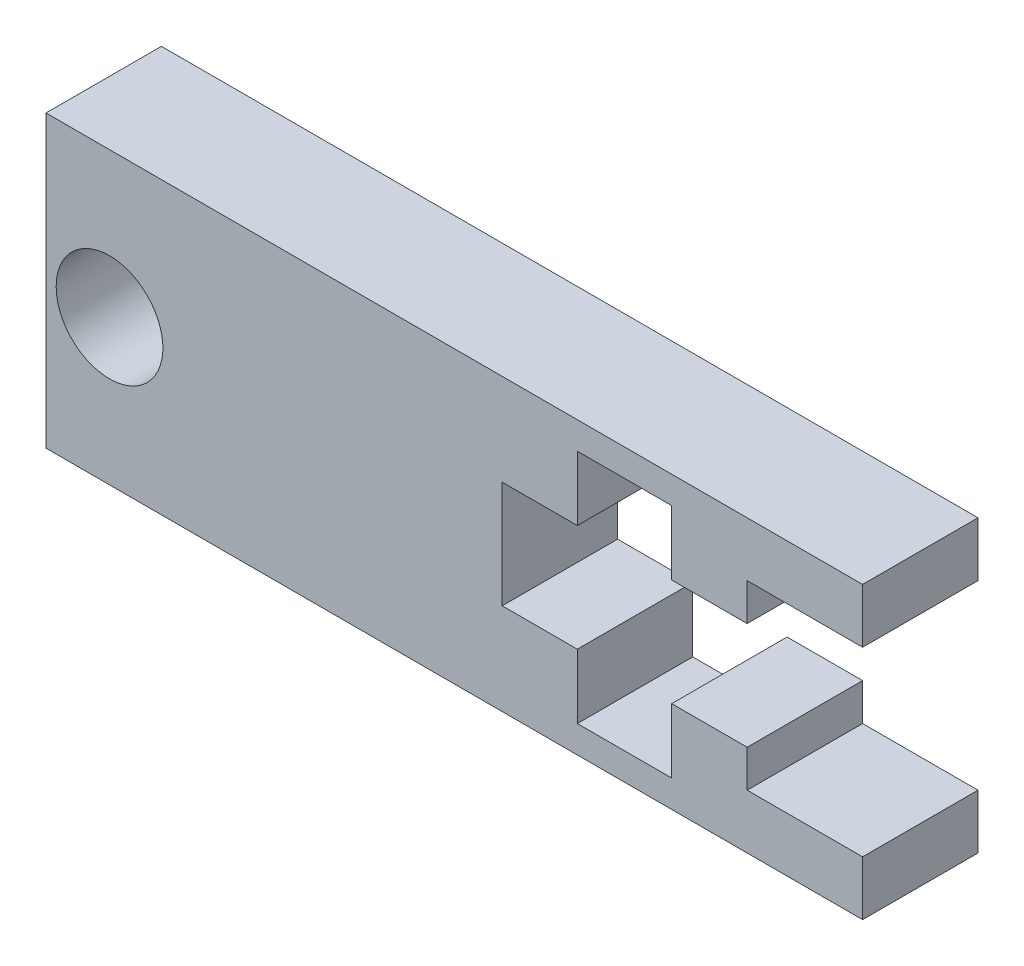
ISO-10303-21;
HEADER;
FILE_DESCRIPTION(('STEP AP214'),'2;1');
FILE_NAME('part.step','',(''),(''),'','','');
FILE_SCHEMA(('AUTOMOTIVE_DESIGN { 1 0 10303 214 1 1 1 1 }'));
ENDSEC;
DATA;
#1=APPLICATION_CONTEXT('core data for automotive mechanical design processes');
#2=APPLICATION_PROTOCOL_DEFINITION('international standard','automotive_design',2000,#1);
#3=PRODUCT_CONTEXT('',#1,'mechanical');
#4=PRODUCT('Part','Part','',(#3));
#5=PRODUCT_RELATED_PRODUCT_CATEGORY('part','',(#4));
#6=PRODUCT_DEFINITION_FORMATION('','',#4);
#7=PRODUCT_DEFINITION_CONTEXT('part definition',#1,'design');
#8=PRODUCT_DEFINITION('design','',#6,#7);
#9=PRODUCT_DEFINITION_SHAPE('','',#8);
#10=(LENGTH_UNIT() NAMED_UNIT(*) SI_UNIT(.MILLI.,.METRE.));
#11=(NAMED_UNIT(*) PLANE_ANGLE_UNIT() SI_UNIT($,.RADIAN.));
#12=(NAMED_UNIT(*) SI_UNIT($,.STERADIAN.) SOLID_ANGLE_UNIT());
#13=UNCERTAINTY_MEASURE_WITH_UNIT(LENGTH_MEASURE(1.E-05),#10,'distance_accuracy_value','');
#14=(GEOMETRIC_REPRESENTATION_CONTEXT(3) GLOBAL_UNCERTAINTY_ASSIGNED_CONTEXT((#13)) GLOBAL_UNIT_ASSIGNED_CONTEXT((#10,
#11,#12)) REPRESENTATION_CONTEXT('',''));
#15=CARTESIAN_POINT('',(0.,0.,0.));
#16=DIRECTION('',(0.,0.,1.));
#17=DIRECTION('',(1.,0.,0.));
#18=AXIS2_PLACEMENT_3D('',#15,#16,#17);
#19=CARTESIAN_POINT('',(11.25,-4.,1.59));
#20=DIRECTION('',(-1.,0.,0.));
#21=DIRECTION('',(0.,0.,1.));
#22=AXIS2_PLACEMENT_3D('',#19,#20,#21);
#23=PLANE('',#22);
#24=DIRECTION('',(0.,1.,0.));
#25=VECTOR('',#24,1.);
#26=CARTESIAN_POINT('',(11.25,-4.,1.59));
#27=LINE('',#26,#25);
#28=CARTESIAN_POINT('',(11.25,2.5,1.59));
#29=VERTEX_POINT('',#28);
#30=CARTESIAN_POINT('',(11.25,4.,1.59));
#31=VERTEX_POINT('',#30);
#32=EDGE_CURVE('E85',#29,#31,#27,.T.);
#33=ORIENTED_EDGE('',*,*,#32,.F.);
#34=DIRECTION('',(0.,0.,-1.));
#35=VECTOR('',#34,1.);
#36=CARTESIAN_POINT('',(11.25,2.5,1.59));
#37=LINE('',#36,#35);
#38=CARTESIAN_POINT('',(11.25,2.5,-1.59));
#39=VERTEX_POINT('',#38);
#40=EDGE_CURVE('E279',#29,#39,#37,.T.);
#41=ORIENTED_EDGE('',*,*,#40,.T.);
#42=DIRECTION('',(0.,1.,0.));
#43=VECTOR('',#42,1.);
#44=CARTESIAN_POINT('',(11.25,-4.,-1.59));
#45=LINE('',#44,#43);
#46=CARTESIAN_POINT('',(11.25,4.,-1.59));
#47=VERTEX_POINT('',#46);
#48=EDGE_CURVE('E312',#39,#47,#45,.T.);
#49=ORIENTED_EDGE('',*,*,#48,.T.);
#50=DIRECTION('',(0.,0.,-1.));
#51=VECTOR('',#50,1.);
#52=CARTESIAN_POINT('',(11.25,4.,1.59));
#53=LINE('',#52,#51);
#54=EDGE_CURVE('E11',#31,#47,#53,.T.);
#55=ORIENTED_EDGE('',*,*,#54,.F.);
#56=EDGE_LOOP('',(#33,#41,#49,#55));
#57=FACE_BOUND('',#56,.T.);
#58=ADVANCED_FACE('F33',(#57),#23,.F.);
#59=CARTESIAN_POINT('',(0.,0.,1.59));
#60=DIRECTION('',(0.,0.,-1.));
#61=DIRECTION('',(-1.,0.,0.));
#62=AXIS2_PLACEMENT_3D('',#59,#60,#61);
#63=PLANE('',#62);
#64=DIRECTION('',(0.,1.,0.));
#65=VECTOR('',#64,1.);
#66=CARTESIAN_POINT('',(8.07,1.475,1.59));
#67=LINE('',#66,#65);
#68=CARTESIAN_POINT('',(8.07,1.475,1.59));
#69=VERTEX_POINT('',#68);
#70=CARTESIAN_POINT('',(8.07,2.5,1.59));
#71=VERTEX_POINT('',#70);
#72=EDGE_CURVE('E237',#69,#71,#67,.T.);
#73=ORIENTED_EDGE('',*,*,#72,.T.);
#74=DIRECTION('',(1.,0.,0.));
#75=VECTOR('',#74,1.);
#76=CARTESIAN_POINT('',(11.25,2.5,1.59));
#77=LINE('',#76,#75);
#78=EDGE_CURVE('E239',#71,#29,#77,.T.);
#79=ORIENTED_EDGE('',*,*,#78,.T.);
#80=ORIENTED_EDGE('',*,*,#32,.T.);
#81=DIRECTION('',(-1.,0.,0.));
#82=VECTOR('',#81,1.);
#83=CARTESIAN_POINT('',(-11.25,4.,1.59));
#84=LINE('',#83,#82);
#85=CARTESIAN_POINT('',(-11.25,4.,1.59));
#86=VERTEX_POINT('',#85);
#87=EDGE_CURVE('E316',#31,#86,#84,.T.);
#88=ORIENTED_EDGE('',*,*,#87,.T.);
#89=DIRECTION('',(0.,-1.,0.));
#90=VECTOR('',#89,1.);
#91=CARTESIAN_POINT('',(-11.25,-4.,1.59));
#92=LINE('',#91,#90);
#93=CARTESIAN_POINT('',(-11.25,-4.,1.59));
#94=VERTEX_POINT('',#93);
#95=EDGE_CURVE('E318',#86,#94,#92,.T.);
#96=ORIENTED_EDGE('',*,*,#95,.T.);
#97=DIRECTION('',(1.,0.,0.));
#98=VECTOR('',#97,1.);
#99=CARTESIAN_POINT('',(-11.25,-4.,1.59));
#100=LINE('',#99,#98);
#101=CARTESIAN_POINT('',(11.25,-4.,1.59));
#102=VERTEX_POINT('',#101);
#103=EDGE_CURVE('E57',#94,#102,#100,.T.);
#104=ORIENTED_EDGE('',*,*,#103,.T.);
#105=CARTESIAN_POINT('',(11.25,-2.5,1.59));
#106=VERTEX_POINT('',#105);
#107=EDGE_CURVE('E200',#102,#106,#27,.T.);
#108=ORIENTED_EDGE('',*,*,#107,.T.);
#109=DIRECTION('',(-1.,0.,0.));
#110=VECTOR('',#109,1.);
#111=CARTESIAN_POINT('',(11.25,-2.5,1.59));
#112=LINE('',#111,#110);
#113=CARTESIAN_POINT('',(8.07,-2.5,1.59));
#114=VERTEX_POINT('',#113);
#115=EDGE_CURVE('E48',#106,#114,#112,.T.);
#116=ORIENTED_EDGE('',*,*,#115,.T.);
#117=DIRECTION('',(0.,1.,0.));
#118=VECTOR('',#117,1.);
#119=CARTESIAN_POINT('',(8.07,-2.5,1.59));
#120=LINE('',#119,#118);
#121=CARTESIAN_POINT('',(8.07,-1.475,1.59));
#122=VERTEX_POINT('',#121);
#123=EDGE_CURVE('E190',#114,#122,#120,.T.);
#124=ORIENTED_EDGE('',*,*,#123,.T.);
#125=DIRECTION('',(-1.,0.,0.));
#126=VECTOR('',#125,1.);
#127=CARTESIAN_POINT('',(8.07,-1.475,1.59));
#128=LINE('',#127,#126);
#129=CARTESIAN_POINT('',(5.99,-1.475,1.59));
#130=VERTEX_POINT('',#129);
#131=EDGE_CURVE('E194',#122,#130,#128,.T.);
#132=ORIENTED_EDGE('',*,*,#131,.T.);
#133=DIRECTION('',(0.,-1.,0.));
#134=VECTOR('',#133,1.);
#135=CARTESIAN_POINT('',(5.99,-3.25,1.59));
#136=LINE('',#135,#134);
#137=CARTESIAN_POINT('',(5.99,-3.25,1.59));
#138=VERTEX_POINT('',#137);
#139=EDGE_CURVE('E207',#130,#138,#136,.T.);
#140=ORIENTED_EDGE('',*,*,#139,.T.);
#141=DIRECTION('',(-1.,0.,0.));
#142=VECTOR('',#141,1.);
#143=CARTESIAN_POINT('',(3.39,-3.25,1.59));
#144=LINE('',#143,#142);
#145=CARTESIAN_POINT('',(3.39,-3.25,1.59));
#146=VERTEX_POINT('',#145);
#147=EDGE_CURVE('E210',#138,#146,#144,.T.);
#148=ORIENTED_EDGE('',*,*,#147,.T.);
#149=DIRECTION('',(0.,1.,0.));
#150=VECTOR('',#149,1.);
#151=CARTESIAN_POINT('',(3.39,-3.25,1.59));
#152=LINE('',#151,#150);
#153=CARTESIAN_POINT('',(3.39,-1.475,1.59));
#154=VERTEX_POINT('',#153);
#155=EDGE_CURVE('E213',#146,#154,#152,.T.);
#156=ORIENTED_EDGE('',*,*,#155,.T.);
#157=DIRECTION('',(-1.,0.,0.));
#158=VECTOR('',#157,1.);
#159=CARTESIAN_POINT('',(3.39,-1.475,1.59));
#160=LINE('',#159,#158);
#161=CARTESIAN_POINT('',(1.32,-1.475,1.59));
#162=VERTEX_POINT('',#161);
#163=EDGE_CURVE('E216',#154,#162,#160,.T.);
#164=ORIENTED_EDGE('',*,*,#163,.T.);
#165=DIRECTION('',(0.,1.,0.));
#166=VECTOR('',#165,1.);
#167=CARTESIAN_POINT('',(1.32,1.475,1.59));
#168=LINE('',#167,#166);
#169=CARTESIAN_POINT('',(1.32,1.475,1.59));
#170=VERTEX_POINT('',#169);
#171=EDGE_CURVE('E219',#162,#170,#168,.T.);
#172=ORIENTED_EDGE('',*,*,#171,.T.);
#173=DIRECTION('',(1.,0.,0.));
#174=VECTOR('',#173,1.);
#175=CARTESIAN_POINT('',(3.39,1.475,1.59));
#176=LINE('',#175,#174);
#177=CARTESIAN_POINT('',(3.39,1.475,1.59));
#178=VERTEX_POINT('',#177);
#179=EDGE_CURVE('E222',#170,#178,#176,.T.);
#180=ORIENTED_EDGE('',*,*,#179,.T.);
#181=DIRECTION('',(0.,1.,0.));
#182=VECTOR('',#181,1.);
#183=CARTESIAN_POINT('',(3.39,1.475,1.59));
#184=LINE('',#183,#182);
#185=CARTESIAN_POINT('',(3.39,3.25,1.59));
#186=VERTEX_POINT('',#185);
#187=EDGE_CURVE('E225',#178,#186,#184,.T.);
#188=ORIENTED_EDGE('',*,*,#187,.T.);
#189=DIRECTION('',(1.,0.,0.));
#190=VECTOR('',#189,1.);
#191=CARTESIAN_POINT('',(3.39,3.25,1.59));
#192=LINE('',#191,#190);
#193=CARTESIAN_POINT('',(5.99,3.25,1.59));
#194=VERTEX_POINT('',#193);
#195=EDGE_CURVE('E228',#186,#194,#192,.T.);
#196=ORIENTED_EDGE('',*,*,#195,.T.);
#197=DIRECTION('',(0.,-1.,0.));
#198=VECTOR('',#197,1.);
#199=CARTESIAN_POINT('',(5.99,1.475,1.59));
#200=LINE('',#199,#198);
#201=CARTESIAN_POINT('',(5.99,1.475,1.59));
#202=VERTEX_POINT('',#201);
#203=EDGE_CURVE('E231',#194,#202,#200,.T.);
#204=ORIENTED_EDGE('',*,*,#203,.T.);
#205=DIRECTION('',(1.,0.,0.));
#206=VECTOR('',#205,1.);
#207=CARTESIAN_POINT('',(8.07,1.475,1.59));
#208=LINE('',#207,#206);
#209=EDGE_CURVE('E234',#202,#69,#208,.T.);
#210=ORIENTED_EDGE('',*,*,#209,.T.);
#211=EDGE_LOOP('',(#73,#79,#80,#88,#96,#104,#108,#116,#124,#132,#140,#148,#156,#164,#172,#180,
#188,#196,#204,#210));
#212=FACE_BOUND('',#211,.T.);
#213=CARTESIAN_POINT('',(-9.49999999999999,0.,1.59));
#214=DIRECTION('',(0.,0.,1.));
#215=DIRECTION('',(1.,0.,0.));
#216=AXIS2_PLACEMENT_3D('',#213,#214,#215);
#217=CIRCLE('',#216,1.47);
#218=CARTESIAN_POINT('',(-10.97,0.,1.59));
#219=VERTEX_POINT('',#218);
#220=EDGE_CURVE('E309',#219,#219,#217,.T.);
#221=ORIENTED_EDGE('',*,*,#220,.F.);
#222=EDGE_LOOP('',(#221));
#223=FACE_BOUND('',#222,.T.);
#224=ADVANCED_FACE('F197',(#212,#223),#63,.F.);
#225=CARTESIAN_POINT('',(0.,0.,-1.59));
#226=DIRECTION('',(0.,0.,-1.));
#227=DIRECTION('',(-1.,0.,0.));
#228=AXIS2_PLACEMENT_3D('',#225,#226,#227);
#229=PLANE('',#228);
#230=DIRECTION('',(1.,0.,0.));
#231=VECTOR('',#230,1.);
#232=CARTESIAN_POINT('',(11.25,2.5,-1.59));
#233=LINE('',#232,#231);
#234=CARTESIAN_POINT('',(8.07,2.5,-1.59));
#235=VERTEX_POINT('',#234);
#236=EDGE_CURVE('E201',#235,#39,#233,.T.);
#237=ORIENTED_EDGE('',*,*,#236,.F.);
#238=DIRECTION('',(0.,1.,0.));
#239=VECTOR('',#238,1.);
#240=CARTESIAN_POINT('',(8.07,1.475,-1.59));
#241=LINE('',#240,#239);
#242=CARTESIAN_POINT('',(8.07,1.475,-1.59));
#243=VERTEX_POINT('',#242);
#244=EDGE_CURVE('E203',#243,#235,#241,.T.);
#245=ORIENTED_EDGE('',*,*,#244,.F.);
#246=DIRECTION('',(1.,0.,0.));
#247=VECTOR('',#246,1.);
#248=CARTESIAN_POINT('',(8.07,1.475,-1.59));
#249=LINE('',#248,#247);
#250=CARTESIAN_POINT('',(5.99,1.475,-1.59));
#251=VERTEX_POINT('',#250);
#252=EDGE_CURVE('E274',#251,#243,#249,.T.);
#253=ORIENTED_EDGE('',*,*,#252,.F.);
#254=DIRECTION('',(0.,-1.,0.));
#255=VECTOR('',#254,1.);
#256=CARTESIAN_POINT('',(5.99,1.475,-1.59));
#257=LINE('',#256,#255);
#258=CARTESIAN_POINT('',(5.99,3.25,-1.59));
#259=VERTEX_POINT('',#258);
#260=EDGE_CURVE('E271',#259,#251,#257,.T.);
#261=ORIENTED_EDGE('',*,*,#260,.F.);
#262=DIRECTION('',(1.,0.,0.));
#263=VECTOR('',#262,1.);
#264=CARTESIAN_POINT('',(3.39,3.25,-1.59));
#265=LINE('',#264,#263);
#266=CARTESIAN_POINT('',(3.39,3.25,-1.59));
#267=VERTEX_POINT('',#266);
#268=EDGE_CURVE('E268',#267,#259,#265,.T.);
#269=ORIENTED_EDGE('',*,*,#268,.F.);
#270=DIRECTION('',(0.,1.,0.));
#271=VECTOR('',#270,1.);
#272=CARTESIAN_POINT('',(3.39,1.475,-1.59));
#273=LINE('',#272,#271);
#274=CARTESIAN_POINT('',(3.39,1.475,-1.59));
#275=VERTEX_POINT('',#274);
#276=EDGE_CURVE('E265',#275,#267,#273,.T.);
#277=ORIENTED_EDGE('',*,*,#276,.F.);
#278=DIRECTION('',(1.,0.,0.));
#279=VECTOR('',#278,1.);
#280=CARTESIAN_POINT('',(3.39,1.475,-1.59));
#281=LINE('',#280,#279);
#282=CARTESIAN_POINT('',(1.32,1.475,-1.59));
#283=VERTEX_POINT('',#282);
#284=EDGE_CURVE('E262',#283,#275,#281,.T.);
#285=ORIENTED_EDGE('',*,*,#284,.F.);
#286=DIRECTION('',(0.,1.,0.));
#287=VECTOR('',#286,1.);
#288=CARTESIAN_POINT('',(1.32,1.475,-1.59));
#289=LINE('',#288,#287);
#290=CARTESIAN_POINT('',(1.32,-1.475,-1.59));
#291=VERTEX_POINT('',#290);
#292=EDGE_CURVE('E259',#291,#283,#289,.T.);
#293=ORIENTED_EDGE('',*,*,#292,.F.);
#294=DIRECTION('',(-1.,0.,0.));
#295=VECTOR('',#294,1.);
#296=CARTESIAN_POINT('',(3.39,-1.475,-1.59));
#297=LINE('',#296,#295);
#298=CARTESIAN_POINT('',(3.39,-1.475,-1.59));
#299=VERTEX_POINT('',#298);
#300=EDGE_CURVE('E256',#299,#291,#297,.T.);
#301=ORIENTED_EDGE('',*,*,#300,.F.);
#302=DIRECTION('',(0.,1.,0.));
#303=VECTOR('',#302,1.);
#304=CARTESIAN_POINT('',(3.39,-3.25,-1.59));
#305=LINE('',#304,#303);
#306=CARTESIAN_POINT('',(3.39,-3.25,-1.59));
#307=VERTEX_POINT('',#306);
#308=EDGE_CURVE('E253',#307,#299,#305,.T.);
#309=ORIENTED_EDGE('',*,*,#308,.F.);
#310=DIRECTION('',(-1.,0.,0.));
#311=VECTOR('',#310,1.);
#312=CARTESIAN_POINT('',(3.39,-3.25,-1.59));
#313=LINE('',#312,#311);
#314=CARTESIAN_POINT('',(5.99,-3.25,-1.59));
#315=VERTEX_POINT('',#314);
#316=EDGE_CURVE('E250',#315,#307,#313,.T.);
#317=ORIENTED_EDGE('',*,*,#316,.F.);
#318=DIRECTION('',(0.,-1.,0.));
#319=VECTOR('',#318,1.);
#320=CARTESIAN_POINT('',(5.99,-3.25,-1.59));
#321=LINE('',#320,#319);
#322=CARTESIAN_POINT('',(5.99,-1.475,-1.59));
#323=VERTEX_POINT('',#322);
#324=EDGE_CURVE('E247',#323,#315,#321,.T.);
#325=ORIENTED_EDGE('',*,*,#324,.F.);
#326=DIRECTION('',(-1.,0.,0.));
#327=VECTOR('',#326,1.);
#328=CARTESIAN_POINT('',(8.07,-1.475,-1.59));
#329=LINE('',#328,#327);
#330=CARTESIAN_POINT('',(8.07,-1.475,-1.59));
#331=VERTEX_POINT('',#330);
#332=EDGE_CURVE('E244',#331,#323,#329,.T.);
#333=ORIENTED_EDGE('',*,*,#332,.F.);
#334=DIRECTION('',(0.,1.,0.));
#335=VECTOR('',#334,1.);
#336=CARTESIAN_POINT('',(8.07,-2.5,-1.59));
#337=LINE('',#336,#335);
#338=CARTESIAN_POINT('',(8.07,-2.5,-1.59));
#339=VERTEX_POINT('',#338);
#340=EDGE_CURVE('E242',#339,#331,#337,.T.);
#341=ORIENTED_EDGE('',*,*,#340,.F.);
#342=DIRECTION('',(-1.,0.,0.));
#343=VECTOR('',#342,1.);
#344=CARTESIAN_POINT('',(11.25,-2.5,-1.59));
#345=LINE('',#344,#343);
#346=CARTESIAN_POINT('',(11.25,-2.5,-1.59));
#347=VERTEX_POINT('',#346);
#348=EDGE_CURVE('E182',#347,#339,#345,.T.);
#349=ORIENTED_EDGE('',*,*,#348,.F.);
#350=CARTESIAN_POINT('',(11.25,-4.,-1.59));
#351=VERTEX_POINT('',#350);
#352=EDGE_CURVE('E322',#351,#347,#45,.T.);
#353=ORIENTED_EDGE('',*,*,#352,.F.);
#354=DIRECTION('',(1.,0.,0.));
#355=VECTOR('',#354,1.);
#356=CARTESIAN_POINT('',(-11.25,-4.,-1.59));
#357=LINE('',#356,#355);
#358=CARTESIAN_POINT('',(-11.25,-4.,-1.59));
#359=VERTEX_POINT('',#358);
#360=EDGE_CURVE('E78',#359,#351,#357,.T.);
#361=ORIENTED_EDGE('',*,*,#360,.F.);
#362=DIRECTION('',(0.,-1.,0.));
#363=VECTOR('',#362,1.);
#364=CARTESIAN_POINT('',(-11.25,-4.,-1.59));
#365=LINE('',#364,#363);
#366=CARTESIAN_POINT('',(-11.25,4.,-1.59));
#367=VERTEX_POINT('',#366);
#368=EDGE_CURVE('E327',#367,#359,#365,.T.);
#369=ORIENTED_EDGE('',*,*,#368,.F.);
#370=DIRECTION('',(-1.,0.,0.));
#371=VECTOR('',#370,1.);
#372=CARTESIAN_POINT('',(-11.25,4.,-1.59));
#373=LINE('',#372,#371);
#374=EDGE_CURVE('E325',#47,#367,#373,.T.);
#375=ORIENTED_EDGE('',*,*,#374,.F.);
#376=ORIENTED_EDGE('',*,*,#48,.F.);
#377=EDGE_LOOP('',(#237,#245,#253,#261,#269,#277,#285,#293,#301,#309,#317,#325,#333,#341,#349,
#353,#361,#369,#375,#376));
#378=FACE_BOUND('',#377,.T.);
#379=CARTESIAN_POINT('',(-9.49999999999999,0.,-1.59));
#380=DIRECTION('',(0.,0.,1.));
#381=DIRECTION('',(1.,0.,0.));
#382=AXIS2_PLACEMENT_3D('',#379,#380,#381);
#383=CIRCLE('',#382,1.47);
#384=CARTESIAN_POINT('',(-10.97,0.,-1.59));
#385=VERTEX_POINT('',#384);
#386=EDGE_CURVE('E282',#385,#385,#383,.T.);
#387=ORIENTED_EDGE('',*,*,#386,.T.);
#388=EDGE_LOOP('',(#387));
#389=FACE_BOUND('',#388,.T.);
#390=ADVANCED_FACE('F343',(#378,#389),#229,.T.);
#391=ORIENTED_EDGE('',*,*,#352,.T.);
#392=DIRECTION('',(0.,0.,-1.));
#393=VECTOR('',#392,1.);
#394=CARTESIAN_POINT('',(11.25,-2.5,1.59));
#395=LINE('',#394,#393);
#396=EDGE_CURVE('E187',#106,#347,#395,.T.);
#397=ORIENTED_EDGE('',*,*,#396,.F.);
#398=ORIENTED_EDGE('',*,*,#107,.F.);
#399=DIRECTION('',(0.,0.,-1.));
#400=VECTOR('',#399,1.);
#401=CARTESIAN_POINT('',(11.25,-4.,1.59));
#402=LINE('',#401,#400);
#403=EDGE_CURVE('E321',#102,#351,#402,.T.);
#404=ORIENTED_EDGE('',*,*,#403,.T.);
#405=EDGE_LOOP('',(#391,#397,#398,#404));
#406=FACE_BOUND('',#405,.T.);
#407=ADVANCED_FACE('F35',(#406),#23,.F.);
#408=CARTESIAN_POINT('',(-11.25,4.,1.59));
#409=DIRECTION('',(0.,-1.,0.));
#410=DIRECTION('',(0.,0.,-1.));
#411=AXIS2_PLACEMENT_3D('',#408,#409,#410);
#412=PLANE('',#411);
#413=ORIENTED_EDGE('',*,*,#374,.T.);
#414=DIRECTION('',(0.,0.,-1.));
#415=VECTOR('',#414,1.);
#416=CARTESIAN_POINT('',(-11.25,4.,1.59));
#417=LINE('',#416,#415);
#418=EDGE_CURVE('E41',#86,#367,#417,.T.);
#419=ORIENTED_EDGE('',*,*,#418,.F.);
#420=ORIENTED_EDGE('',*,*,#87,.F.);
#421=ORIENTED_EDGE('',*,*,#54,.T.);
#422=EDGE_LOOP('',(#413,#419,#420,#421));
#423=FACE_BOUND('',#422,.T.);
#424=ADVANCED_FACE('F359',(#423),#412,.F.);
#425=CARTESIAN_POINT('',(-11.25,-4.,1.59));
#426=DIRECTION('',(1.,0.,0.));
#427=DIRECTION('',(0.,0.,-1.));
#428=AXIS2_PLACEMENT_3D('',#425,#426,#427);
#429=PLANE('',#428);
#430=ORIENTED_EDGE('',*,*,#368,.T.);
#431=DIRECTION('',(0.,0.,-1.));
#432=VECTOR('',#431,1.);
#433=CARTESIAN_POINT('',(-11.25,-4.,1.59));
#434=LINE('',#433,#432);
#435=EDGE_CURVE('E331',#94,#359,#434,.T.);
#436=ORIENTED_EDGE('',*,*,#435,.F.);
#437=ORIENTED_EDGE('',*,*,#95,.F.);
#438=ORIENTED_EDGE('',*,*,#418,.T.);
#439=EDGE_LOOP('',(#430,#436,#437,#438));
#440=FACE_BOUND('',#439,.T.);
#441=ADVANCED_FACE('F337',(#440),#429,.F.);
#442=CARTESIAN_POINT('',(-11.25,-4.,1.59));
#443=DIRECTION('',(0.,1.,0.));
#444=DIRECTION('',(0.,0.,1.));
#445=AXIS2_PLACEMENT_3D('',#442,#443,#444);
#446=PLANE('',#445);
#447=ORIENTED_EDGE('',*,*,#360,.T.);
#448=ORIENTED_EDGE('',*,*,#403,.F.);
#449=ORIENTED_EDGE('',*,*,#103,.F.);
#450=ORIENTED_EDGE('',*,*,#435,.T.);
#451=EDGE_LOOP('',(#447,#448,#449,#450));
#452=FACE_BOUND('',#451,.T.);
#453=ADVANCED_FACE('F348',(#452),#446,.F.);
#454=CARTESIAN_POINT('',(-9.49999999999999,0.,1.59));
#455=DIRECTION('',(0.,0.,-1.));
#456=DIRECTION('',(-1.,0.,0.));
#457=AXIS2_PLACEMENT_3D('',#454,#455,#456);
#458=CYLINDRICAL_SURFACE('',#457,1.47);
#459=CARTESIAN_POINT('',(-10.97,0.,1.59));
#460=CARTESIAN_POINT('',(-10.97,0.,1.556875));
#461=CARTESIAN_POINT('',(-10.97,0.,1.52375));
#462=CARTESIAN_POINT('',(-10.97,0.,1.4575));
#463=CARTESIAN_POINT('',(-10.97,0.,1.424375));
#464=CARTESIAN_POINT('',(-10.97,0.,1.358125));
#465=CARTESIAN_POINT('',(-10.97,0.,1.325));
#466=CARTESIAN_POINT('',(-10.97,0.,1.25875));
#467=CARTESIAN_POINT('',(-10.97,0.,1.225625));
#468=CARTESIAN_POINT('',(-10.97,0.,1.159375));
#469=CARTESIAN_POINT('',(-10.97,0.,1.12625));
#470=CARTESIAN_POINT('',(-10.97,0.,1.06));
#471=CARTESIAN_POINT('',(-10.97,0.,1.026875));
#472=CARTESIAN_POINT('',(-10.97,0.,0.960625));
#473=CARTESIAN_POINT('',(-10.97,0.,0.9275));
#474=CARTESIAN_POINT('',(-10.97,0.,0.86125));
#475=CARTESIAN_POINT('',(-10.97,0.,0.828125));
#476=CARTESIAN_POINT('',(-10.97,0.,0.761875));
#477=CARTESIAN_POINT('',(-10.97,0.,0.72875));
#478=CARTESIAN_POINT('',(-10.97,0.,0.6625));
#479=CARTESIAN_POINT('',(-10.97,0.,0.629375));
#480=CARTESIAN_POINT('',(-10.97,0.,0.563125));
#481=CARTESIAN_POINT('',(-10.97,0.,0.53));
#482=CARTESIAN_POINT('',(-10.97,0.,0.46375));
#483=CARTESIAN_POINT('',(-10.97,0.,0.430625));
#484=CARTESIAN_POINT('',(-10.97,0.,0.364375));
#485=CARTESIAN_POINT('',(-10.97,0.,0.33125));
#486=CARTESIAN_POINT('',(-10.97,0.,0.265));
#487=CARTESIAN_POINT('',(-10.97,0.,0.231875));
#488=CARTESIAN_POINT('',(-10.97,0.,0.165625));
#489=CARTESIAN_POINT('',(-10.97,0.,0.1325));
#490=CARTESIAN_POINT('',(-10.97,0.,0.06625));
#491=CARTESIAN_POINT('',(-10.97,0.,0.033125));
#492=CARTESIAN_POINT('',(-10.97,0.,-0.033125));
#493=CARTESIAN_POINT('',(-10.97,0.,-0.06625));
#494=CARTESIAN_POINT('',(-10.97,0.,-0.1325));
#495=CARTESIAN_POINT('',(-10.97,0.,-0.165625));
#496=CARTESIAN_POINT('',(-10.97,0.,-0.231875));
#497=CARTESIAN_POINT('',(-10.97,0.,-0.265));
#498=CARTESIAN_POINT('',(-10.97,0.,-0.33125));
#499=CARTESIAN_POINT('',(-10.97,0.,-0.364375));
#500=CARTESIAN_POINT('',(-10.97,0.,-0.430625));
#501=CARTESIAN_POINT('',(-10.97,0.,-0.46375));
#502=CARTESIAN_POINT('',(-10.97,0.,-0.53));
#503=CARTESIAN_POINT('',(-10.97,0.,-0.563125));
#504=CARTESIAN_POINT('',(-10.97,0.,-0.629375));
#505=CARTESIAN_POINT('',(-10.97,0.,-0.6625));
#506=CARTESIAN_POINT('',(-10.97,0.,-0.72875));
#507=CARTESIAN_POINT('',(-10.97,0.,-0.761875));
#508=CARTESIAN_POINT('',(-10.97,0.,-0.828125));
#509=CARTESIAN_POINT('',(-10.97,0.,-0.86125));
#510=CARTESIAN_POINT('',(-10.97,0.,-0.9275));
#511=CARTESIAN_POINT('',(-10.97,0.,-0.960625));
#512=CARTESIAN_POINT('',(-10.97,0.,-1.026875));
#513=CARTESIAN_POINT('',(-10.97,0.,-1.06));
#514=CARTESIAN_POINT('',(-10.97,0.,-1.12625));
#515=CARTESIAN_POINT('',(-10.97,0.,-1.159375));
#516=CARTESIAN_POINT('',(-10.97,0.,-1.225625));
#517=CARTESIAN_POINT('',(-10.97,0.,-1.25875));
#518=CARTESIAN_POINT('',(-10.97,0.,-1.325));
#519=CARTESIAN_POINT('',(-10.97,0.,-1.358125));
#520=CARTESIAN_POINT('',(-10.97,0.,-1.424375));
#521=CARTESIAN_POINT('',(-10.97,0.,-1.4575));
#522=CARTESIAN_POINT('',(-10.97,0.,-1.52375));
#523=CARTESIAN_POINT('',(-10.97,0.,-1.556875));
#524=CARTESIAN_POINT('',(-10.97,0.,-1.59));
#525=B_SPLINE_CURVE_WITH_KNOTS('',3,(#459,#460,#461,#462,#463,#464,#465,#466,#467,#468,#469,
#470,#471,#472,#473,#474,#475,#476,#477,#478,#479,#480,#481,#482,#483,#484,#485,#486,#487,#488,
#489,#490,#491,#492,#493,#494,#495,#496,#497,#498,#499,#500,#501,#502,#503,#504,#505,#506,#507,
#508,#509,#510,#511,#512,#513,#514,#515,#516,#517,#518,#519,#520,#521,#522,#523,#524),
.UNSPECIFIED.,.F.,.F.,(4,2,2,2,2,2,2,2,2,2,2,2,2,2,2,2,2,2,2,2,2,2,2,2,2,2,2,2,2,2,2,2,4),(0.,
0.0993750000000001,0.19875,0.298125,0.3975,0.496875,0.59625,0.695625,0.795,0.894375,0.99375,
1.093125,1.1925,1.291875,1.39125,1.490625,1.59,1.689375,1.78875,1.888125,1.9875,2.086875,
2.18625,2.285625,2.385,2.484375,2.58375,2.683125,2.7825,2.881875,2.98125,3.080625,3.18),.UNSPECIFIED.);
#526=EDGE_CURVE('BSEAM350',#219,#385,#525,.T.);
#527=ORIENTED_EDGE('',*,*,#220,.T.);
#528=ORIENTED_EDGE('',*,*,#386,.F.);
#529=ORIENTED_EDGE('',*,*,#526,.T.);
#530=ORIENTED_EDGE('',*,*,#526,.F.);
#531=EDGE_LOOP('',(#527,#529,#528,#530));
#532=FACE_BOUND('',#531,.T.);
#533=ADVANCED_FACE('F350',(#532),#458,.F.);
#534=CARTESIAN_POINT('',(11.25,2.5,1.59));
#535=DIRECTION('',(0.,1.,0.));
#536=DIRECTION('',(0.,0.,1.));
#537=AXIS2_PLACEMENT_3D('',#534,#535,#536);
#538=PLANE('',#537);
#539=ORIENTED_EDGE('',*,*,#236,.T.);
#540=ORIENTED_EDGE('',*,*,#40,.F.);
#541=ORIENTED_EDGE('',*,*,#78,.F.);
#542=DIRECTION('',(0.,0.,-1.));
#543=VECTOR('',#542,1.);
#544=CARTESIAN_POINT('',(8.07,2.5,1.59));
#545=LINE('',#544,#543);
#546=EDGE_CURVE('E283',#71,#235,#545,.T.);
#547=ORIENTED_EDGE('',*,*,#546,.T.);
#548=EDGE_LOOP('',(#539,#540,#541,#547));
#549=FACE_BOUND('',#548,.T.);
#550=ADVANCED_FACE('F356',(#549),#538,.F.);
#551=CARTESIAN_POINT('',(8.07,1.475,1.59));
#552=DIRECTION('',(-1.,0.,0.));
#553=DIRECTION('',(0.,0.,1.));
#554=AXIS2_PLACEMENT_3D('',#551,#552,#553);
#555=PLANE('',#554);
#556=ORIENTED_EDGE('',*,*,#244,.T.);
#557=ORIENTED_EDGE('',*,*,#546,.F.);
#558=ORIENTED_EDGE('',*,*,#72,.F.);
#559=DIRECTION('',(0.,0.,-1.));
#560=VECTOR('',#559,1.);
#561=CARTESIAN_POINT('',(8.07,1.475,1.59));
#562=LINE('',#561,#560);
#563=EDGE_CURVE('E285',#69,#243,#562,.T.);
#564=ORIENTED_EDGE('',*,*,#563,.T.);
#565=EDGE_LOOP('',(#556,#557,#558,#564));
#566=FACE_BOUND('',#565,.T.);
#567=ADVANCED_FACE('F423',(#566),#555,.F.);
#568=CARTESIAN_POINT('',(8.07,1.475,1.59));
#569=DIRECTION('',(0.,1.,0.));
#570=DIRECTION('',(0.,0.,1.));
#571=AXIS2_PLACEMENT_3D('',#568,#569,#570);
#572=PLANE('',#571);
#573=ORIENTED_EDGE('',*,*,#252,.T.);
#574=ORIENTED_EDGE('',*,*,#563,.F.);
#575=ORIENTED_EDGE('',*,*,#209,.F.);
#576=DIRECTION('',(0.,0.,-1.));
#577=VECTOR('',#576,1.);
#578=CARTESIAN_POINT('',(5.99,1.475,1.59));
#579=LINE('',#578,#577);
#580=EDGE_CURVE('E287',#202,#251,#579,.T.);
#581=ORIENTED_EDGE('',*,*,#580,.T.);
#582=EDGE_LOOP('',(#573,#574,#575,#581));
#583=FACE_BOUND('',#582,.T.);
#584=ADVANCED_FACE('F419',(#583),#572,.F.);
#585=CARTESIAN_POINT('',(5.99,1.475,1.59));
#586=DIRECTION('',(1.,0.,0.));
#587=DIRECTION('',(0.,0.,-1.));
#588=AXIS2_PLACEMENT_3D('',#585,#586,#587);
#589=PLANE('',#588);
#590=ORIENTED_EDGE('',*,*,#260,.T.);
#591=ORIENTED_EDGE('',*,*,#580,.F.);
#592=ORIENTED_EDGE('',*,*,#203,.F.);
#593=DIRECTION('',(0.,0.,-1.));
#594=VECTOR('',#593,1.);
#595=CARTESIAN_POINT('',(5.99,3.25,1.59));
#596=LINE('',#595,#594);
#597=EDGE_CURVE('E289',#194,#259,#596,.T.);
#598=ORIENTED_EDGE('',*,*,#597,.T.);
#599=EDGE_LOOP('',(#590,#591,#592,#598));
#600=FACE_BOUND('',#599,.T.);
#601=ADVANCED_FACE('F415',(#600),#589,.F.);
#602=CARTESIAN_POINT('',(3.39,3.25,1.59));
#603=DIRECTION('',(0.,1.,0.));
#604=DIRECTION('',(-1.,0.,0.));
#605=AXIS2_PLACEMENT_3D('',#602,#603,#604);
#606=PLANE('',#605);
#607=ORIENTED_EDGE('',*,*,#268,.T.);
#608=ORIENTED_EDGE('',*,*,#597,.F.);
#609=ORIENTED_EDGE('',*,*,#195,.F.);
#610=DIRECTION('',(0.,0.,-1.));
#611=VECTOR('',#610,1.);
#612=CARTESIAN_POINT('',(3.39,3.25,1.59));
#613=LINE('',#612,#611);
#614=EDGE_CURVE('E291',#186,#267,#613,.T.);
#615=ORIENTED_EDGE('',*,*,#614,.T.);
#616=EDGE_LOOP('',(#607,#608,#609,#615));
#617=FACE_BOUND('',#616,.T.);
#618=ADVANCED_FACE('F411',(#617),#606,.F.);
#619=CARTESIAN_POINT('',(3.39,1.475,1.59));
#620=DIRECTION('',(-1.,0.,0.));
#621=DIRECTION('',(0.,0.,1.));
#622=AXIS2_PLACEMENT_3D('',#619,#620,#621);
#623=PLANE('',#622);
#624=ORIENTED_EDGE('',*,*,#276,.T.);
#625=ORIENTED_EDGE('',*,*,#614,.F.);
#626=ORIENTED_EDGE('',*,*,#187,.F.);
#627=DIRECTION('',(0.,0.,-1.));
#628=VECTOR('',#627,1.);
#629=CARTESIAN_POINT('',(3.39,1.475,1.59));
#630=LINE('',#629,#628);
#631=EDGE_CURVE('E293',#178,#275,#630,.T.);
#632=ORIENTED_EDGE('',*,*,#631,.T.);
#633=EDGE_LOOP('',(#624,#625,#626,#632));
#634=FACE_BOUND('',#633,.T.);
#635=ADVANCED_FACE('F407',(#634),#623,.F.);
#636=CARTESIAN_POINT('',(3.39,1.475,1.59));
#637=DIRECTION('',(0.,1.,0.));
#638=DIRECTION('',(0.,0.,1.));
#639=AXIS2_PLACEMENT_3D('',#636,#637,#638);
#640=PLANE('',#639);
#641=ORIENTED_EDGE('',*,*,#284,.T.);
#642=ORIENTED_EDGE('',*,*,#631,.F.);
#643=ORIENTED_EDGE('',*,*,#179,.F.);
#644=DIRECTION('',(0.,0.,-1.));
#645=VECTOR('',#644,1.);
#646=CARTESIAN_POINT('',(1.32,1.475,1.59));
#647=LINE('',#646,#645);
#648=EDGE_CURVE('E295',#170,#283,#647,.T.);
#649=ORIENTED_EDGE('',*,*,#648,.T.);
#650=EDGE_LOOP('',(#641,#642,#643,#649));
#651=FACE_BOUND('',#650,.T.);
#652=ADVANCED_FACE('F403',(#651),#640,.F.);
#653=CARTESIAN_POINT('',(1.32,1.475,1.59));
#654=DIRECTION('',(-1.,0.,0.));
#655=DIRECTION('',(0.,0.,1.));
#656=AXIS2_PLACEMENT_3D('',#653,#654,#655);
#657=PLANE('',#656);
#658=ORIENTED_EDGE('',*,*,#292,.T.);
#659=ORIENTED_EDGE('',*,*,#648,.F.);
#660=ORIENTED_EDGE('',*,*,#171,.F.);
#661=DIRECTION('',(0.,0.,-1.));
#662=VECTOR('',#661,1.);
#663=CARTESIAN_POINT('',(1.32,-1.475,1.59));
#664=LINE('',#663,#662);
#665=EDGE_CURVE('E297',#162,#291,#664,.T.);
#666=ORIENTED_EDGE('',*,*,#665,.T.);
#667=EDGE_LOOP('',(#658,#659,#660,#666));
#668=FACE_BOUND('',#667,.T.);
#669=ADVANCED_FACE('F399',(#668),#657,.F.);
#670=CARTESIAN_POINT('',(3.39,-1.475,1.59));
#671=DIRECTION('',(0.,-1.,0.));
#672=DIRECTION('',(0.,0.,-1.));
#673=AXIS2_PLACEMENT_3D('',#670,#671,#672);
#674=PLANE('',#673);
#675=ORIENTED_EDGE('',*,*,#300,.T.);
#676=ORIENTED_EDGE('',*,*,#665,.F.);
#677=ORIENTED_EDGE('',*,*,#163,.F.);
#678=DIRECTION('',(0.,0.,-1.));
#679=VECTOR('',#678,1.);
#680=CARTESIAN_POINT('',(3.39,-1.475,1.59));
#681=LINE('',#680,#679);
#682=EDGE_CURVE('E299',#154,#299,#681,.T.);
#683=ORIENTED_EDGE('',*,*,#682,.T.);
#684=EDGE_LOOP('',(#675,#676,#677,#683));
#685=FACE_BOUND('',#684,.T.);
#686=ADVANCED_FACE('F395',(#685),#674,.F.);
#687=CARTESIAN_POINT('',(3.39,-3.25,1.59));
#688=DIRECTION('',(-1.,0.,0.));
#689=DIRECTION('',(0.,0.,1.));
#690=AXIS2_PLACEMENT_3D('',#687,#688,#689);
#691=PLANE('',#690);
#692=ORIENTED_EDGE('',*,*,#308,.T.);
#693=ORIENTED_EDGE('',*,*,#682,.F.);
#694=ORIENTED_EDGE('',*,*,#155,.F.);
#695=DIRECTION('',(0.,0.,-1.));
#696=VECTOR('',#695,1.);
#697=CARTESIAN_POINT('',(3.39,-3.25,1.59));
#698=LINE('',#697,#696);
#699=EDGE_CURVE('E301',#146,#307,#698,.T.);
#700=ORIENTED_EDGE('',*,*,#699,.T.);
#701=EDGE_LOOP('',(#692,#693,#694,#700));
#702=FACE_BOUND('',#701,.T.);
#703=ADVANCED_FACE('F391',(#702),#691,.F.);
#704=CARTESIAN_POINT('',(3.39,-3.25,1.59));
#705=DIRECTION('',(0.,-1.,0.));
#706=DIRECTION('',(1.,0.,0.));
#707=AXIS2_PLACEMENT_3D('',#704,#705,#706);
#708=PLANE('',#707);
#709=ORIENTED_EDGE('',*,*,#316,.T.);
#710=ORIENTED_EDGE('',*,*,#699,.F.);
#711=ORIENTED_EDGE('',*,*,#147,.F.);
#712=DIRECTION('',(0.,0.,-1.));
#713=VECTOR('',#712,1.);
#714=CARTESIAN_POINT('',(5.99,-3.25,1.59));
#715=LINE('',#714,#713);
#716=EDGE_CURVE('E303',#138,#315,#715,.T.);
#717=ORIENTED_EDGE('',*,*,#716,.T.);
#718=EDGE_LOOP('',(#709,#710,#711,#717));
#719=FACE_BOUND('',#718,.T.);
#720=ADVANCED_FACE('F387',(#719),#708,.F.);
#721=CARTESIAN_POINT('',(5.99,-3.25,1.59));
#722=DIRECTION('',(1.,0.,0.));
#723=DIRECTION('',(0.,0.,-1.));
#724=AXIS2_PLACEMENT_3D('',#721,#722,#723);
#725=PLANE('',#724);
#726=ORIENTED_EDGE('',*,*,#324,.T.);
#727=ORIENTED_EDGE('',*,*,#716,.F.);
#728=ORIENTED_EDGE('',*,*,#139,.F.);
#729=DIRECTION('',(0.,0.,-1.));
#730=VECTOR('',#729,1.);
#731=CARTESIAN_POINT('',(5.99,-1.475,1.59));
#732=LINE('',#731,#730);
#733=EDGE_CURVE('E305',#130,#323,#732,.T.);
#734=ORIENTED_EDGE('',*,*,#733,.T.);
#735=EDGE_LOOP('',(#726,#727,#728,#734));
#736=FACE_BOUND('',#735,.T.);
#737=ADVANCED_FACE('F383',(#736),#725,.F.);
#738=CARTESIAN_POINT('',(8.07,-1.475,1.59));
#739=DIRECTION('',(0.,-1.,0.));
#740=DIRECTION('',(0.,0.,-1.));
#741=AXIS2_PLACEMENT_3D('',#738,#739,#740);
#742=PLANE('',#741);
#743=ORIENTED_EDGE('',*,*,#332,.T.);
#744=ORIENTED_EDGE('',*,*,#733,.F.);
#745=ORIENTED_EDGE('',*,*,#131,.F.);
#746=DIRECTION('',(0.,0.,-1.));
#747=VECTOR('',#746,1.);
#748=CARTESIAN_POINT('',(8.07,-1.475,1.59));
#749=LINE('',#748,#747);
#750=EDGE_CURVE('E186',#122,#331,#749,.T.);
#751=ORIENTED_EDGE('',*,*,#750,.T.);
#752=EDGE_LOOP('',(#743,#744,#745,#751));
#753=FACE_BOUND('',#752,.T.);
#754=ADVANCED_FACE('F380',(#753),#742,.F.);
#755=CARTESIAN_POINT('',(8.07,-2.5,1.59));
#756=DIRECTION('',(-1.,0.,0.));
#757=DIRECTION('',(0.,0.,1.));
#758=AXIS2_PLACEMENT_3D('',#755,#756,#757);
#759=PLANE('',#758);
#760=ORIENTED_EDGE('',*,*,#340,.T.);
#761=ORIENTED_EDGE('',*,*,#750,.F.);
#762=ORIENTED_EDGE('',*,*,#123,.F.);
#763=DIRECTION('',(0.,0.,-1.));
#764=VECTOR('',#763,1.);
#765=CARTESIAN_POINT('',(8.07,-2.5,1.59));
#766=LINE('',#765,#764);
#767=EDGE_CURVE('E178',#114,#339,#766,.T.);
#768=ORIENTED_EDGE('',*,*,#767,.T.);
#769=EDGE_LOOP('',(#760,#761,#762,#768));
#770=FACE_BOUND('',#769,.T.);
#771=ADVANCED_FACE('F191',(#770),#759,.F.);
#772=CARTESIAN_POINT('',(11.25,-2.5,1.59));
#773=DIRECTION('',(0.,-1.,0.));
#774=DIRECTION('',(0.,0.,-1.));
#775=AXIS2_PLACEMENT_3D('',#772,#773,#774);
#776=PLANE('',#775);
#777=ORIENTED_EDGE('',*,*,#348,.T.);
#778=ORIENTED_EDGE('',*,*,#767,.F.);
#779=ORIENTED_EDGE('',*,*,#115,.F.);
#780=ORIENTED_EDGE('',*,*,#396,.T.);
#781=EDGE_LOOP('',(#777,#778,#779,#780));
#782=FACE_BOUND('',#781,.T.);
#783=ADVANCED_FACE('F180',(#782),#776,.F.);
#784=CLOSED_SHELL('',(#58,#224,#390,#407,#424,#441,#453,#533,#550,#567,#584,#601,#618,#635,#652,
#669,#686,#703,#720,#737,#754,#771,#783));
#785=MANIFOLD_SOLID_BREP('B2',#784);
#786=ADVANCED_BREP_SHAPE_REPRESENTATION('',(#18,#785),#14);
#787=SHAPE_DEFINITION_REPRESENTATION(#9,#786);
ENDSEC;
END-ISO-10303-21;
